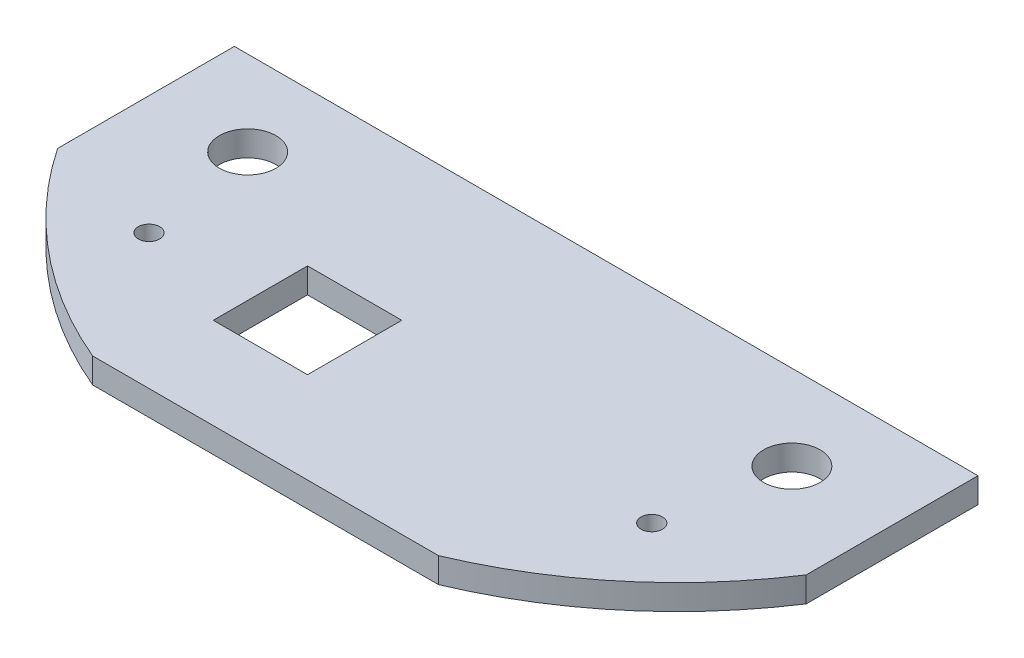
ISO-10303-21;
HEADER;
FILE_DESCRIPTION(('STEP AP214'),'2;1');
FILE_NAME('part.step','',(''),(''),'','','');
FILE_SCHEMA(('AUTOMOTIVE_DESIGN { 1 0 10303 214 1 1 1 1 }'));
ENDSEC;
DATA;
#1=APPLICATION_CONTEXT('core data for automotive mechanical design processes');
#2=APPLICATION_PROTOCOL_DEFINITION('international standard','automotive_design',2000,#1);
#3=PRODUCT_CONTEXT('',#1,'mechanical');
#4=PRODUCT('Part','Part','',(#3));
#5=PRODUCT_RELATED_PRODUCT_CATEGORY('part','',(#4));
#6=PRODUCT_DEFINITION_FORMATION('','',#4);
#7=PRODUCT_DEFINITION_CONTEXT('part definition',#1,'design');
#8=PRODUCT_DEFINITION('design','',#6,#7);
#9=PRODUCT_DEFINITION_SHAPE('','',#8);
#10=(LENGTH_UNIT() NAMED_UNIT(*) SI_UNIT(.MILLI.,.METRE.));
#11=(NAMED_UNIT(*) PLANE_ANGLE_UNIT() SI_UNIT($,.RADIAN.));
#12=(NAMED_UNIT(*) SI_UNIT($,.STERADIAN.) SOLID_ANGLE_UNIT());
#13=UNCERTAINTY_MEASURE_WITH_UNIT(LENGTH_MEASURE(1.E-05),#10,'distance_accuracy_value','');
#14=(GEOMETRIC_REPRESENTATION_CONTEXT(3) GLOBAL_UNCERTAINTY_ASSIGNED_CONTEXT((#13)) GLOBAL_UNIT_ASSIGNED_CONTEXT((#10,
#11,#12)) REPRESENTATION_CONTEXT('',''));
#15=CARTESIAN_POINT('',(0.,0.,0.));
#16=DIRECTION('',(0.,0.,1.));
#17=DIRECTION('',(1.,0.,0.));
#18=AXIS2_PLACEMENT_3D('',#15,#16,#17);
#19=CARTESIAN_POINT('',(0.,4.,0.));
#20=DIRECTION('',(0.,1.,0.));
#21=DIRECTION('',(0.,0.,1.));
#22=AXIS2_PLACEMENT_3D('',#19,#20,#21);
#23=PLANE('',#22);
#24=CARTESIAN_POINT('',(-40.,4.,0.));
#25=DIRECTION('',(0.,1.,0.));
#26=DIRECTION('',(0.,0.,1.));
#27=AXIS2_PLACEMENT_3D('',#24,#25,#26);
#28=CIRCLE('',#27,1.69999999999999);
#29=CARTESIAN_POINT('',(-40.,4.,1.69999999999999));
#30=VERTEX_POINT('',#29);
#31=EDGE_CURVE('E351',#30,#30,#28,.T.);
#32=ORIENTED_EDGE('',*,*,#31,.F.);
#33=EDGE_LOOP('',(#32));
#34=FACE_BOUND('',#33,.T.);
#35=CARTESIAN_POINT('',(40.,4.,0.));
#36=DIRECTION('',(0.,1.,0.));
#37=DIRECTION('',(0.,0.,1.));
#38=AXIS2_PLACEMENT_3D('',#35,#36,#37);
#39=CIRCLE('',#38,1.69999999999999);
#40=CARTESIAN_POINT('',(40.,4.,1.69999999999999));
#41=VERTEX_POINT('',#40);
#42=EDGE_CURVE('E353',#41,#41,#39,.T.);
#43=ORIENTED_EDGE('',*,*,#42,.F.);
#44=EDGE_LOOP('',(#43));
#45=FACE_BOUND('',#44,.T.);
#46=DIRECTION('',(0.,0.,-1.));
#47=VECTOR('',#46,1.);
#48=CARTESIAN_POINT('',(-7.83518795418849,4.,6.94229935529098));
#49=LINE('',#48,#47);
#50=CARTESIAN_POINT('',(-7.83518795418849,4.,6.94229935529098));
#51=VERTEX_POINT('',#50);
#52=CARTESIAN_POINT('',(-7.83518795418849,4.,-8.05770064470902));
#53=VERTEX_POINT('',#52);
#54=EDGE_CURVE('E47',#51,#53,#49,.T.);
#55=ORIENTED_EDGE('',*,*,#54,.F.);
#56=DIRECTION('',(1.,0.,0.));
#57=VECTOR('',#56,1.);
#58=CARTESIAN_POINT('',(-22.8351879541885,4.,6.94229935529098));
#59=LINE('',#58,#57);
#60=CARTESIAN_POINT('',(-22.8351879541885,4.,6.94229935529098));
#61=VERTEX_POINT('',#60);
#62=EDGE_CURVE('E126',#61,#51,#59,.T.);
#63=ORIENTED_EDGE('',*,*,#62,.F.);
#64=DIRECTION('',(0.,0.,1.));
#65=VECTOR('',#64,1.);
#66=CARTESIAN_POINT('',(-22.8351879541885,4.,6.94229935529098));
#67=LINE('',#66,#65);
#68=CARTESIAN_POINT('',(-22.8351879541885,4.,-8.05770064470902));
#69=VERTEX_POINT('',#68);
#70=EDGE_CURVE('E129',#69,#61,#67,.T.);
#71=ORIENTED_EDGE('',*,*,#70,.F.);
#72=DIRECTION('',(-1.,0.,0.));
#73=VECTOR('',#72,1.);
#74=CARTESIAN_POINT('',(-22.8351879541885,4.,-8.05770064470902));
#75=LINE('',#74,#73);
#76=EDGE_CURVE('E138',#53,#69,#75,.T.);
#77=ORIENTED_EDGE('',*,*,#76,.F.);
#78=EDGE_LOOP('',(#55,#63,#71,#77));
#79=FACE_BOUND('',#78,.T.);
#80=CARTESIAN_POINT('',(-43.3,4.,-19.));
#81=DIRECTION('',(0.,1.,0.));
#82=DIRECTION('',(0.,0.,1.));
#83=AXIS2_PLACEMENT_3D('',#80,#81,#82);
#84=CIRCLE('',#83,4.49999999999999);
#85=CARTESIAN_POINT('',(-43.3,4.,-14.5));
#86=VERTEX_POINT('',#85);
#87=EDGE_CURVE('E160',#86,#86,#84,.T.);
#88=ORIENTED_EDGE('',*,*,#87,.F.);
#89=EDGE_LOOP('',(#88));
#90=FACE_BOUND('',#89,.T.);
#91=CARTESIAN_POINT('',(43.3,4.,-19.));
#92=DIRECTION('',(0.,1.,0.));
#93=DIRECTION('',(0.,0.,1.));
#94=AXIS2_PLACEMENT_3D('',#91,#92,#93);
#95=CIRCLE('',#94,4.49999999999999);
#96=CARTESIAN_POINT('',(43.3,4.,-14.5));
#97=VERTEX_POINT('',#96);
#98=EDGE_CURVE('E166',#97,#97,#95,.T.);
#99=ORIENTED_EDGE('',*,*,#98,.F.);
#100=EDGE_LOOP('',(#99));
#101=FACE_BOUND('',#100,.T.);
#102=DIRECTION('',(1.,0.,0.));
#103=VECTOR('',#102,1.);
#104=CARTESIAN_POINT('',(-58.9016078409477,4.,21.4508286154455));
#105=LINE('',#104,#103);
#106=CARTESIAN_POINT('',(-27.5118348667672,4.,21.4508286154455));
#107=VERTEX_POINT('',#106);
#108=CARTESIAN_POINT('',(27.5118348667672,4.,21.4508286154455));
#109=VERTEX_POINT('',#108);
#110=EDGE_CURVE('E176',#107,#109,#105,.T.);
#111=ORIENTED_EDGE('',*,*,#110,.T.);
#112=CARTESIAN_POINT('',(0.,4.,-44.0021999032085));
#113=DIRECTION('',(0.,1.,0.));
#114=DIRECTION('',(0.,0.,1.));
#115=AXIS2_PLACEMENT_3D('',#112,#113,#114);
#116=CIRCLE('',#115,71.);
#117=CARTESIAN_POINT('',(59.4279414408331,4.,-5.15223495978919));
#118=VERTEX_POINT('',#117);
#119=EDGE_CURVE('E152',#109,#118,#116,.T.);
#120=ORIENTED_EDGE('',*,*,#119,.T.);
#121=DIRECTION('',(0.,0.,-1.));
#122=VECTOR('',#121,1.);
#123=CARTESIAN_POINT('',(59.4279414408331,4.,21.4508286154455));
#124=LINE('',#123,#122);
#125=CARTESIAN_POINT('',(59.4279414408331,4.,-32.4861702876838));
#126=VERTEX_POINT('',#125);
#127=EDGE_CURVE('E180',#118,#126,#124,.T.);
#128=ORIENTED_EDGE('',*,*,#127,.T.);
#129=DIRECTION('',(-1.,0.,0.));
#130=VECTOR('',#129,1.);
#131=CARTESIAN_POINT('',(-58.9016078409477,4.,-32.4861702876838));
#132=LINE('',#131,#130);
#133=CARTESIAN_POINT('',(-58.9016078409477,4.,-32.4861702876838));
#134=VERTEX_POINT('',#133);
#135=EDGE_CURVE('E182',#126,#134,#132,.T.);
#136=ORIENTED_EDGE('',*,*,#135,.T.);
#137=DIRECTION('',(0.,0.,1.));
#138=VECTOR('',#137,1.);
#139=CARTESIAN_POINT('',(-58.9016078409477,4.,-6.71150016706346));
#140=LINE('',#139,#138);
#141=CARTESIAN_POINT('',(-58.9016078409477,4.,-4.35878186501196));
#142=VERTEX_POINT('',#141);
#143=EDGE_CURVE('E173',#134,#142,#140,.T.);
#144=ORIENTED_EDGE('',*,*,#143,.T.);
#145=EDGE_CURVE('E144',#142,#107,#116,.T.);
#146=ORIENTED_EDGE('',*,*,#145,.T.);
#147=EDGE_LOOP('',(#111,#120,#128,#136,#144,#146));
#148=FACE_BOUND('',#147,.T.);
#149=ADVANCED_FACE('F32',(#34,#45,#79,#90,#101,#148),#23,.T.);
#150=CARTESIAN_POINT('',(0.,0.,0.));
#151=DIRECTION('',(0.,1.,0.));
#152=DIRECTION('',(0.,0.,1.));
#153=AXIS2_PLACEMENT_3D('',#150,#151,#152);
#154=PLANE('',#153);
#155=CARTESIAN_POINT('',(-40.,0.,0.));
#156=DIRECTION('',(0.,1.,0.));
#157=DIRECTION('',(0.,0.,1.));
#158=AXIS2_PLACEMENT_3D('',#155,#156,#157);
#159=CIRCLE('',#158,1.7);
#160=CARTESIAN_POINT('',(-40.,0.,1.70000000000001));
#161=VERTEX_POINT('',#160);
#162=EDGE_CURVE('E349',#161,#161,#159,.T.);
#163=ORIENTED_EDGE('',*,*,#162,.T.);
#164=EDGE_LOOP('',(#163));
#165=FACE_BOUND('',#164,.T.);
#166=CARTESIAN_POINT('',(40.,0.,0.));
#167=DIRECTION('',(0.,1.,0.));
#168=DIRECTION('',(0.,0.,1.));
#169=AXIS2_PLACEMENT_3D('',#166,#167,#168);
#170=CIRCLE('',#169,1.7);
#171=CARTESIAN_POINT('',(40.,0.,1.70000000000001));
#172=VERTEX_POINT('',#171);
#173=EDGE_CURVE('E132',#172,#172,#170,.T.);
#174=ORIENTED_EDGE('',*,*,#173,.T.);
#175=EDGE_LOOP('',(#174));
#176=FACE_BOUND('',#175,.T.);
#177=DIRECTION('',(1.,0.,0.));
#178=VECTOR('',#177,1.);
#179=CARTESIAN_POINT('',(-22.8351879541885,0.,6.94229935529098));
#180=LINE('',#179,#178);
#181=CARTESIAN_POINT('',(-22.8351879541885,0.,6.94229935529098));
#182=VERTEX_POINT('',#181);
#183=CARTESIAN_POINT('',(-7.83518795418849,0.,6.94229935529098));
#184=VERTEX_POINT('',#183);
#185=EDGE_CURVE('E116',#182,#184,#180,.T.);
#186=ORIENTED_EDGE('',*,*,#185,.T.);
#187=DIRECTION('',(0.,0.,-1.));
#188=VECTOR('',#187,1.);
#189=CARTESIAN_POINT('',(-7.83518795418849,0.,6.94229935529098));
#190=LINE('',#189,#188);
#191=CARTESIAN_POINT('',(-7.83518795418849,0.,-8.05770064470902));
#192=VERTEX_POINT('',#191);
#193=EDGE_CURVE('E110',#184,#192,#190,.T.);
#194=ORIENTED_EDGE('',*,*,#193,.T.);
#195=DIRECTION('',(-1.,0.,0.));
#196=VECTOR('',#195,1.);
#197=CARTESIAN_POINT('',(-22.8351879541885,0.,-8.05770064470902));
#198=LINE('',#197,#196);
#199=CARTESIAN_POINT('',(-22.8351879541885,0.,-8.05770064470902));
#200=VERTEX_POINT('',#199);
#201=EDGE_CURVE('E119',#192,#200,#198,.T.);
#202=ORIENTED_EDGE('',*,*,#201,.T.);
#203=DIRECTION('',(0.,0.,1.));
#204=VECTOR('',#203,1.);
#205=CARTESIAN_POINT('',(-22.8351879541885,0.,6.94229935529098));
#206=LINE('',#205,#204);
#207=EDGE_CURVE('E55',#200,#182,#206,.T.);
#208=ORIENTED_EDGE('',*,*,#207,.T.);
#209=EDGE_LOOP('',(#186,#194,#202,#208));
#210=FACE_BOUND('',#209,.T.);
#211=CARTESIAN_POINT('',(-43.3,0.,-19.));
#212=DIRECTION('',(0.,1.,0.));
#213=DIRECTION('',(0.,0.,1.));
#214=AXIS2_PLACEMENT_3D('',#211,#212,#213);
#215=CIRCLE('',#214,4.5);
#216=CARTESIAN_POINT('',(-43.3,0.,-14.5));
#217=VERTEX_POINT('',#216);
#218=EDGE_CURVE('E163',#217,#217,#215,.T.);
#219=ORIENTED_EDGE('',*,*,#218,.T.);
#220=EDGE_LOOP('',(#219));
#221=FACE_BOUND('',#220,.T.);
#222=CARTESIAN_POINT('',(43.3,0.,-19.));
#223=DIRECTION('',(0.,1.,0.));
#224=DIRECTION('',(0.,0.,1.));
#225=AXIS2_PLACEMENT_3D('',#222,#223,#224);
#226=CIRCLE('',#225,4.5);
#227=CARTESIAN_POINT('',(43.3,0.,-14.5));
#228=VERTEX_POINT('',#227);
#229=EDGE_CURVE('E169',#228,#228,#226,.T.);
#230=ORIENTED_EDGE('',*,*,#229,.T.);
#231=EDGE_LOOP('',(#230));
#232=FACE_BOUND('',#231,.T.);
#233=CARTESIAN_POINT('',(0.,0.,-44.0021999032085));
#234=DIRECTION('',(0.,1.,0.));
#235=DIRECTION('',(0.,0.,1.));
#236=AXIS2_PLACEMENT_3D('',#233,#234,#235);
#237=CIRCLE('',#236,71.);
#238=CARTESIAN_POINT('',(27.5118348667672,0.,21.4508286154455));
#239=VERTEX_POINT('',#238);
#240=CARTESIAN_POINT('',(59.4279414408331,0.,-5.15223495978919));
#241=VERTEX_POINT('',#240);
#242=EDGE_CURVE('E148',#239,#241,#237,.T.);
#243=ORIENTED_EDGE('',*,*,#242,.F.);
#244=DIRECTION('',(1.,0.,0.));
#245=VECTOR('',#244,1.);
#246=CARTESIAN_POINT('',(-58.9016078409477,0.,21.4508286154455));
#247=LINE('',#246,#245);
#248=CARTESIAN_POINT('',(-27.5118348667672,0.,21.4508286154455));
#249=VERTEX_POINT('',#248);
#250=EDGE_CURVE('E172',#249,#239,#247,.T.);
#251=ORIENTED_EDGE('',*,*,#250,.F.);
#252=CARTESIAN_POINT('',(-58.9016078409477,0.,-4.35878186501196));
#253=VERTEX_POINT('',#252);
#254=EDGE_CURVE('E151',#253,#249,#237,.T.);
#255=ORIENTED_EDGE('',*,*,#254,.F.);
#256=DIRECTION('',(0.,0.,1.));
#257=VECTOR('',#256,1.);
#258=CARTESIAN_POINT('',(-58.9016078409477,0.,-6.71150016706346));
#259=LINE('',#258,#257);
#260=CARTESIAN_POINT('',(-58.9016078409477,0.,-32.4861702876838));
#261=VERTEX_POINT('',#260);
#262=EDGE_CURVE('E177',#261,#253,#259,.T.);
#263=ORIENTED_EDGE('',*,*,#262,.F.);
#264=DIRECTION('',(-1.,0.,0.));
#265=VECTOR('',#264,1.);
#266=CARTESIAN_POINT('',(-58.9016078409477,0.,-32.4861702876838));
#267=LINE('',#266,#265);
#268=CARTESIAN_POINT('',(59.4279414408331,0.,-32.4861702876838));
#269=VERTEX_POINT('',#268);
#270=EDGE_CURVE('E190',#269,#261,#267,.T.);
#271=ORIENTED_EDGE('',*,*,#270,.F.);
#272=DIRECTION('',(0.,0.,-1.));
#273=VECTOR('',#272,1.);
#274=CARTESIAN_POINT('',(59.4279414408331,0.,-32.4861702876838));
#275=LINE('',#274,#273);
#276=EDGE_CURVE('E188',#241,#269,#275,.T.);
#277=ORIENTED_EDGE('',*,*,#276,.F.);
#278=EDGE_LOOP('',(#243,#251,#255,#263,#271,#277));
#279=FACE_BOUND('',#278,.T.);
#280=ADVANCED_FACE('F123',(#165,#176,#210,#221,#232,#279),#154,.F.);
#281=CARTESIAN_POINT('',(-58.9016078409477,4.,21.4508286154455));
#282=DIRECTION('',(0.,0.,-1.));
#283=DIRECTION('',(-1.,0.,0.));
#284=AXIS2_PLACEMENT_3D('',#281,#282,#283);
#285=PLANE('',#284);
#286=DIRECTION('',(0.,1.,0.));
#287=VECTOR('',#286,1.);
#288=CARTESIAN_POINT('',(-27.5118348667672,0.,21.4508286154455));
#289=LINE('',#288,#287);
#290=EDGE_CURVE('E158',#249,#107,#289,.T.);
#291=ORIENTED_EDGE('',*,*,#290,.F.);
#292=ORIENTED_EDGE('',*,*,#250,.T.);
#293=DIRECTION('',(0.,1.,0.));
#294=VECTOR('',#293,1.);
#295=CARTESIAN_POINT('',(27.5118348667672,0.,21.4508286154455));
#296=LINE('',#295,#294);
#297=EDGE_CURVE('E156',#109,#239,#296,.F.);
#298=ORIENTED_EDGE('',*,*,#297,.F.);
#299=ORIENTED_EDGE('',*,*,#110,.F.);
#300=EDGE_LOOP('',(#291,#292,#298,#299));
#301=FACE_BOUND('',#300,.T.);
#302=ADVANCED_FACE('F34',(#301),#285,.F.);
#303=CARTESIAN_POINT('',(59.4279414408331,4.,-32.4861702876838));
#304=DIRECTION('',(-1.,0.,0.));
#305=DIRECTION('',(0.,0.,1.));
#306=AXIS2_PLACEMENT_3D('',#303,#304,#305);
#307=PLANE('',#306);
#308=DIRECTION('',(0.,1.,0.));
#309=VECTOR('',#308,1.);
#310=CARTESIAN_POINT('',(59.4279414408331,0.,-5.15223495978919));
#311=LINE('',#310,#309);
#312=EDGE_CURVE('E150',#241,#118,#311,.T.);
#313=ORIENTED_EDGE('',*,*,#312,.F.);
#314=ORIENTED_EDGE('',*,*,#276,.T.);
#315=DIRECTION('',(0.,-1.,0.));
#316=VECTOR('',#315,1.);
#317=CARTESIAN_POINT('',(59.4279414408331,4.,-32.4861702876838));
#318=LINE('',#317,#316);
#319=EDGE_CURVE('E40',#126,#269,#318,.T.);
#320=ORIENTED_EDGE('',*,*,#319,.F.);
#321=ORIENTED_EDGE('',*,*,#127,.F.);
#322=EDGE_LOOP('',(#313,#314,#320,#321));
#323=FACE_BOUND('',#322,.T.);
#324=ADVANCED_FACE('F216',(#323),#307,.F.);
#325=CARTESIAN_POINT('',(-58.9016078409477,4.,-6.71150016706346));
#326=DIRECTION('',(1.,0.,0.));
#327=DIRECTION('',(0.,0.,-1.));
#328=AXIS2_PLACEMENT_3D('',#325,#326,#327);
#329=PLANE('',#328);
#330=DIRECTION('',(0.,1.,0.));
#331=VECTOR('',#330,1.);
#332=CARTESIAN_POINT('',(-58.9016078409477,0.,-4.35878186501196));
#333=LINE('',#332,#331);
#334=EDGE_CURVE('E11',#142,#253,#333,.F.);
#335=ORIENTED_EDGE('',*,*,#334,.F.);
#336=ORIENTED_EDGE('',*,*,#143,.F.);
#337=DIRECTION('',(0.,-1.,0.));
#338=VECTOR('',#337,1.);
#339=CARTESIAN_POINT('',(-58.9016078409477,4.,-32.4861702876838));
#340=LINE('',#339,#338);
#341=EDGE_CURVE('E185',#134,#261,#340,.T.);
#342=ORIENTED_EDGE('',*,*,#341,.T.);
#343=ORIENTED_EDGE('',*,*,#262,.T.);
#344=EDGE_LOOP('',(#335,#336,#342,#343));
#345=FACE_BOUND('',#344,.T.);
#346=ADVANCED_FACE('F212',(#345),#329,.F.);
#347=CARTESIAN_POINT('',(-58.9016078409477,4.,-32.4861702876838));
#348=DIRECTION('',(0.,0.,1.));
#349=DIRECTION('',(1.,0.,0.));
#350=AXIS2_PLACEMENT_3D('',#347,#348,#349);
#351=PLANE('',#350);
#352=ORIENTED_EDGE('',*,*,#270,.T.);
#353=ORIENTED_EDGE('',*,*,#341,.F.);
#354=ORIENTED_EDGE('',*,*,#135,.F.);
#355=ORIENTED_EDGE('',*,*,#319,.T.);
#356=EDGE_LOOP('',(#352,#353,#354,#355));
#357=FACE_BOUND('',#356,.T.);
#358=ADVANCED_FACE('F200',(#357),#351,.F.);
#359=CARTESIAN_POINT('',(43.3,4.,-19.));
#360=DIRECTION('',(0.,1.,0.));
#361=DIRECTION('',(0.,0.,1.));
#362=AXIS2_PLACEMENT_3D('',#359,#360,#361);
#363=CYLINDRICAL_SURFACE('',#362,4.49999999999999);
#364=ORIENTED_EDGE('',*,*,#229,.F.);
#365=EDGE_LOOP('',(#364));
#366=FACE_BOUND('',#365,.T.);
#367=ORIENTED_EDGE('',*,*,#98,.T.);
#368=EDGE_LOOP('',(#367));
#369=FACE_BOUND('',#368,.T.);
#370=ADVANCED_FACE('F232',(#366,#369),#363,.F.);
#371=CARTESIAN_POINT('',(-43.3,4.,-19.));
#372=DIRECTION('',(0.,1.,0.));
#373=DIRECTION('',(0.,0.,1.));
#374=AXIS2_PLACEMENT_3D('',#371,#372,#373);
#375=CYLINDRICAL_SURFACE('',#374,4.49999999999999);
#376=ORIENTED_EDGE('',*,*,#218,.F.);
#377=EDGE_LOOP('',(#376));
#378=FACE_BOUND('',#377,.T.);
#379=ORIENTED_EDGE('',*,*,#87,.T.);
#380=EDGE_LOOP('',(#379));
#381=FACE_BOUND('',#380,.T.);
#382=ADVANCED_FACE('F226',(#378,#381),#375,.F.);
#383=CARTESIAN_POINT('',(0.,0.,-44.0021999032085));
#384=DIRECTION('',(0.,1.,0.));
#385=DIRECTION('',(0.,0.,1.));
#386=AXIS2_PLACEMENT_3D('',#383,#384,#385);
#387=CYLINDRICAL_SURFACE('',#386,71.);
#388=ORIENTED_EDGE('',*,*,#290,.T.);
#389=ORIENTED_EDGE('',*,*,#145,.F.);
#390=ORIENTED_EDGE('',*,*,#334,.T.);
#391=ORIENTED_EDGE('',*,*,#254,.T.);
#392=EDGE_LOOP('',(#388,#389,#390,#391));
#393=FACE_BOUND('',#392,.T.);
#394=ADVANCED_FACE('F224',(#393),#387,.T.);
#395=ORIENTED_EDGE('',*,*,#297,.T.);
#396=ORIENTED_EDGE('',*,*,#242,.T.);
#397=ORIENTED_EDGE('',*,*,#312,.T.);
#398=ORIENTED_EDGE('',*,*,#119,.F.);
#399=EDGE_LOOP('',(#395,#396,#397,#398));
#400=FACE_BOUND('',#399,.T.);
#401=ADVANCED_FACE('F218',(#400),#387,.T.);
#402=CARTESIAN_POINT('',(-7.83518795418849,0.,6.94229935529098));
#403=DIRECTION('',(1.,0.,0.));
#404=DIRECTION('',(0.,0.,-1.));
#405=AXIS2_PLACEMENT_3D('',#402,#403,#404);
#406=PLANE('',#405);
#407=ORIENTED_EDGE('',*,*,#54,.T.);
#408=DIRECTION('',(0.,1.,0.));
#409=VECTOR('',#408,1.);
#410=CARTESIAN_POINT('',(-7.83518795418849,0.,-8.05770064470902));
#411=LINE('',#410,#409);
#412=EDGE_CURVE('E106',#192,#53,#411,.T.);
#413=ORIENTED_EDGE('',*,*,#412,.F.);
#414=ORIENTED_EDGE('',*,*,#193,.F.);
#415=DIRECTION('',(0.,1.,0.));
#416=VECTOR('',#415,1.);
#417=CARTESIAN_POINT('',(-7.83518795418849,0.,6.94229935529098));
#418=LINE('',#417,#416);
#419=EDGE_CURVE('E142',#184,#51,#418,.T.);
#420=ORIENTED_EDGE('',*,*,#419,.T.);
#421=EDGE_LOOP('',(#407,#413,#414,#420));
#422=FACE_BOUND('',#421,.T.);
#423=ADVANCED_FACE('F108',(#422),#406,.F.);
#424=CARTESIAN_POINT('',(-22.8351879541885,0.,6.94229935529098));
#425=DIRECTION('',(0.,0.,1.));
#426=DIRECTION('',(1.,0.,0.));
#427=AXIS2_PLACEMENT_3D('',#424,#425,#426);
#428=PLANE('',#427);
#429=ORIENTED_EDGE('',*,*,#62,.T.);
#430=ORIENTED_EDGE('',*,*,#419,.F.);
#431=ORIENTED_EDGE('',*,*,#185,.F.);
#432=DIRECTION('',(0.,1.,0.));
#433=VECTOR('',#432,1.);
#434=CARTESIAN_POINT('',(-22.8351879541885,0.,6.94229935529098));
#435=LINE('',#434,#433);
#436=EDGE_CURVE('E145',#182,#61,#435,.T.);
#437=ORIENTED_EDGE('',*,*,#436,.T.);
#438=EDGE_LOOP('',(#429,#430,#431,#437));
#439=FACE_BOUND('',#438,.T.);
#440=ADVANCED_FACE('F296',(#439),#428,.F.);
#441=CARTESIAN_POINT('',(-22.8351879541885,0.,6.94229935529098));
#442=DIRECTION('',(-1.,0.,0.));
#443=DIRECTION('',(0.,0.,1.));
#444=AXIS2_PLACEMENT_3D('',#441,#442,#443);
#445=PLANE('',#444);
#446=ORIENTED_EDGE('',*,*,#70,.T.);
#447=ORIENTED_EDGE('',*,*,#436,.F.);
#448=ORIENTED_EDGE('',*,*,#207,.F.);
#449=DIRECTION('',(0.,1.,0.));
#450=VECTOR('',#449,1.);
#451=CARTESIAN_POINT('',(-22.8351879541885,0.,-8.05770064470902));
#452=LINE('',#451,#450);
#453=EDGE_CURVE('E115',#200,#69,#452,.T.);
#454=ORIENTED_EDGE('',*,*,#453,.T.);
#455=EDGE_LOOP('',(#446,#447,#448,#454));
#456=FACE_BOUND('',#455,.T.);
#457=ADVANCED_FACE('F306',(#456),#445,.F.);
#458=CARTESIAN_POINT('',(-22.8351879541885,0.,-8.05770064470902));
#459=DIRECTION('',(0.,0.,-1.));
#460=DIRECTION('',(-1.,0.,0.));
#461=AXIS2_PLACEMENT_3D('',#458,#459,#460);
#462=PLANE('',#461);
#463=ORIENTED_EDGE('',*,*,#76,.T.);
#464=ORIENTED_EDGE('',*,*,#453,.F.);
#465=ORIENTED_EDGE('',*,*,#201,.F.);
#466=ORIENTED_EDGE('',*,*,#412,.T.);
#467=EDGE_LOOP('',(#463,#464,#465,#466));
#468=FACE_BOUND('',#467,.T.);
#469=ADVANCED_FACE('F120',(#468),#462,.F.);
#470=CARTESIAN_POINT('',(40.,4.,0.));
#471=DIRECTION('',(0.,1.,0.));
#472=DIRECTION('',(0.,0.,1.));
#473=AXIS2_PLACEMENT_3D('',#470,#471,#472);
#474=CYLINDRICAL_SURFACE('',#473,1.69999999999999);
#475=ORIENTED_EDGE('',*,*,#173,.F.);
#476=EDGE_LOOP('',(#475));
#477=FACE_BOUND('',#476,.T.);
#478=ORIENTED_EDGE('',*,*,#42,.T.);
#479=EDGE_LOOP('',(#478));
#480=FACE_BOUND('',#479,.T.);
#481=ADVANCED_FACE('F322',(#477,#480),#474,.F.);
#482=CARTESIAN_POINT('',(-40.,4.,0.));
#483=DIRECTION('',(0.,1.,0.));
#484=DIRECTION('',(0.,0.,1.));
#485=AXIS2_PLACEMENT_3D('',#482,#483,#484);
#486=CYLINDRICAL_SURFACE('',#485,1.69999999999999);
#487=ORIENTED_EDGE('',*,*,#162,.F.);
#488=EDGE_LOOP('',(#487));
#489=FACE_BOUND('',#488,.T.);
#490=ORIENTED_EDGE('',*,*,#31,.T.);
#491=EDGE_LOOP('',(#490));
#492=FACE_BOUND('',#491,.T.);
#493=ADVANCED_FACE('F332',(#489,#492),#486,.F.);
#494=CLOSED_SHELL('',(#149,#280,#302,#324,#346,#358,#370,#382,#394,#401,#423,#440,#457,#469,
#481,#493));
#495=MANIFOLD_SOLID_BREP('B2',#494);
#496=ADVANCED_BREP_SHAPE_REPRESENTATION('',(#18,#495),#14);
#497=SHAPE_DEFINITION_REPRESENTATION(#9,#496);
ENDSEC;
END-ISO-10303-21;
